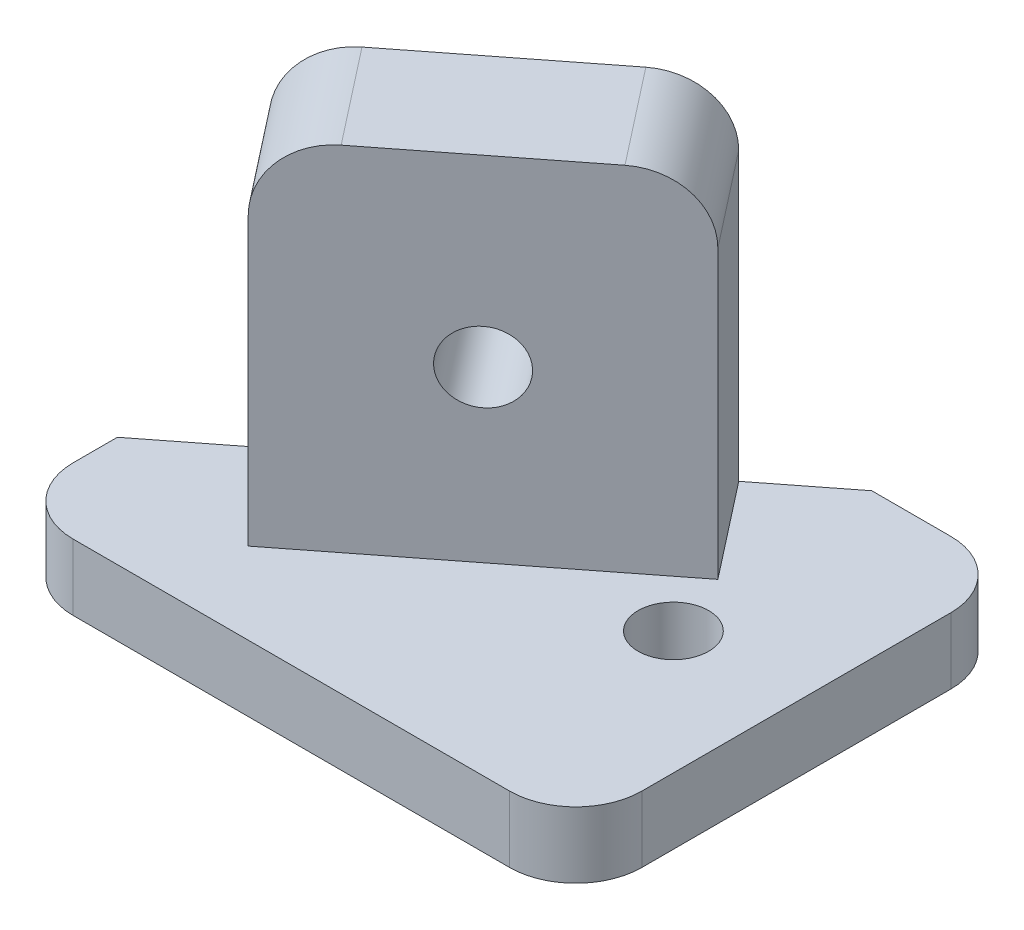
ISO-10303-21;
HEADER;
FILE_DESCRIPTION(('STEP AP214'),'2;1');
FILE_NAME('part.step','',(''),(''),'','','');
FILE_SCHEMA(('AUTOMOTIVE_DESIGN { 1 0 10303 214 1 1 1 1 }'));
ENDSEC;
DATA;
#1=APPLICATION_CONTEXT('core data for automotive mechanical design processes');
#2=APPLICATION_PROTOCOL_DEFINITION('international standard','automotive_design',2000,#1);
#3=PRODUCT_CONTEXT('',#1,'mechanical');
#4=PRODUCT('Part','Part','',(#3));
#5=PRODUCT_RELATED_PRODUCT_CATEGORY('part','',(#4));
#6=PRODUCT_DEFINITION_FORMATION('','',#4);
#7=PRODUCT_DEFINITION_CONTEXT('part definition',#1,'design');
#8=PRODUCT_DEFINITION('design','',#6,#7);
#9=PRODUCT_DEFINITION_SHAPE('','',#8);
#10=(LENGTH_UNIT() NAMED_UNIT(*) SI_UNIT(.MILLI.,.METRE.));
#11=(NAMED_UNIT(*) PLANE_ANGLE_UNIT() SI_UNIT($,.RADIAN.));
#12=(NAMED_UNIT(*) SI_UNIT($,.STERADIAN.) SOLID_ANGLE_UNIT());
#13=UNCERTAINTY_MEASURE_WITH_UNIT(LENGTH_MEASURE(1.E-05),#10,'distance_accuracy_value','');
#14=(GEOMETRIC_REPRESENTATION_CONTEXT(3) GLOBAL_UNCERTAINTY_ASSIGNED_CONTEXT((#13)) GLOBAL_UNIT_ASSIGNED_CONTEXT((#10,
#11,#12)) REPRESENTATION_CONTEXT('',''));
#15=CARTESIAN_POINT('',(0.,0.,0.));
#16=DIRECTION('',(0.,0.,1.));
#17=DIRECTION('',(1.,0.,0.));
#18=AXIS2_PLACEMENT_3D('',#15,#16,#17);
#19=CARTESIAN_POINT('',(0.,3.,0.));
#20=DIRECTION('',(0.,-1.,0.));
#21=DIRECTION('',(0.,0.,-1.));
#22=AXIS2_PLACEMENT_3D('',#19,#20,#21);
#23=PLANE('',#22);
#24=CARTESIAN_POINT('',(20.2068553419679,3.,-10.));
#25=DIRECTION('',(0.,1.,0.));
#26=DIRECTION('',(0.,0.,1.));
#27=AXIS2_PLACEMENT_3D('',#24,#25,#26);
#28=CIRCLE('',#27,1.6);
#29=CARTESIAN_POINT('',(20.2068553419679,3.,-8.4));
#30=VERTEX_POINT('',#29);
#31=EDGE_CURVE('E257',#30,#30,#28,.T.);
#32=ORIENTED_EDGE('',*,*,#31,.F.);
#33=EDGE_LOOP('',(#32));
#34=FACE_BOUND('',#33,.T.);
#35=DIRECTION('',(0.,0.,-1.));
#36=VECTOR('',#35,1.);
#37=CARTESIAN_POINT('',(25.7798023970531,3.,0.));
#38=LINE('',#37,#36);
#39=CARTESIAN_POINT('',(25.7798023970531,3.,-3.));
#40=VERTEX_POINT('',#39);
#41=CARTESIAN_POINT('',(25.7798023970531,3.,-17.));
#42=VERTEX_POINT('',#41);
#43=EDGE_CURVE('E274',#40,#42,#38,.T.);
#44=ORIENTED_EDGE('',*,*,#43,.T.);
#45=CARTESIAN_POINT('',(22.7798023970531,3.,-17.));
#46=DIRECTION('',(0.,-1.,0.));
#47=DIRECTION('',(0.,0.,-1.));
#48=AXIS2_PLACEMENT_3D('',#45,#46,#47);
#49=CIRCLE('',#48,3.);
#50=CARTESIAN_POINT('',(22.7798023970531,3.,-20.));
#51=VERTEX_POINT('',#50);
#52=EDGE_CURVE('E235',#42,#51,#49,.F.);
#53=ORIENTED_EDGE('',*,*,#52,.T.);
#54=DIRECTION('',(-1.,0.,0.));
#55=VECTOR('',#54,1.);
#56=CARTESIAN_POINT('',(19.1991244828961,3.,-20.));
#57=LINE('',#56,#55);
#58=CARTESIAN_POINT('',(19.1991244828961,3.,-20.));
#59=VERTEX_POINT('',#58);
#60=EDGE_CURVE('E271',#51,#59,#57,.T.);
#61=ORIENTED_EDGE('',*,*,#60,.T.);
#62=DIRECTION('',(-0.788010753606721,0.,0.61566147532566));
#63=VECTOR('',#62,1.);
#64=CARTESIAN_POINT('',(0.,3.,-5.));
#65=LINE('',#64,#63);
#66=CARTESIAN_POINT('',(15.8133388296092,3.,-17.3547343346542));
#67=VERTEX_POINT('',#66);
#68=EDGE_CURVE('E267',#59,#67,#65,.T.);
#69=ORIENTED_EDGE('',*,*,#68,.T.);
#70=DIRECTION('',(-0.61566147532566,0.,-0.78801075360672));
#71=VECTOR('',#70,1.);
#72=CARTESIAN_POINT('',(19.1913823456126,3.,-13.0310358031616));
#73=LINE('',#72,#71);
#74=CARTESIAN_POINT('',(19.1913823456126,3.,-13.0310358031616));
#75=VERTEX_POINT('',#74);
#76=EDGE_CURVE('E157',#75,#67,#73,.T.);
#77=ORIENTED_EDGE('',*,*,#76,.F.);
#78=DIRECTION('',(0.788010753606721,0.,-0.61566147532566));
#79=VECTOR('',#78,1.);
#80=CARTESIAN_POINT('',(7.23987337583888,3.,-3.69349363001129));
#81=LINE('',#80,#79);
#82=CARTESIAN_POINT('',(7.23987337583888,3.,-3.69349363001129));
#83=VERTEX_POINT('',#82);
#84=EDGE_CURVE('E142',#83,#75,#81,.T.);
#85=ORIENTED_EDGE('',*,*,#84,.F.);
#86=DIRECTION('',(0.61566147532566,0.,0.788010753606721));
#87=VECTOR('',#86,1.);
#88=CARTESIAN_POINT('',(3.86182985983547,3.,-8.01719216150392));
#89=LINE('',#88,#87);
#90=CARTESIAN_POINT('',(3.86182985983547,3.,-8.01719216150392));
#91=VERTEX_POINT('',#90);
#92=EDGE_CURVE('E153',#91,#83,#89,.T.);
#93=ORIENTED_EDGE('',*,*,#92,.F.);
#94=CARTESIAN_POINT('',(0.,3.,-5.));
#95=VERTEX_POINT('',#94);
#96=EDGE_CURVE('E168',#91,#95,#65,.T.);
#97=ORIENTED_EDGE('',*,*,#96,.T.);
#98=DIRECTION('',(0.,0.,1.));
#99=VECTOR('',#98,1.);
#100=CARTESIAN_POINT('',(0.,3.,0.));
#101=LINE('',#100,#99);
#102=CARTESIAN_POINT('',(0.,3.,-3.));
#103=VERTEX_POINT('',#102);
#104=EDGE_CURVE('E263',#95,#103,#101,.T.);
#105=ORIENTED_EDGE('',*,*,#104,.T.);
#106=CARTESIAN_POINT('',(3.,3.,-3.));
#107=DIRECTION('',(0.,-1.,0.));
#108=DIRECTION('',(0.,0.,-1.));
#109=AXIS2_PLACEMENT_3D('',#106,#107,#108);
#110=CIRCLE('',#109,3.);
#111=CARTESIAN_POINT('',(3.,3.,0.));
#112=VERTEX_POINT('',#111);
#113=EDGE_CURVE('E57',#103,#112,#110,.F.);
#114=ORIENTED_EDGE('',*,*,#113,.T.);
#115=DIRECTION('',(1.,0.,0.));
#116=VECTOR('',#115,1.);
#117=CARTESIAN_POINT('',(0.,3.,0.));
#118=LINE('',#117,#116);
#119=CARTESIAN_POINT('',(22.7798023970531,3.,0.));
#120=VERTEX_POINT('',#119);
#121=EDGE_CURVE('E242',#112,#120,#118,.T.);
#122=ORIENTED_EDGE('',*,*,#121,.T.);
#123=CARTESIAN_POINT('',(22.7798023970531,3.,-3.));
#124=DIRECTION('',(0.,-1.,0.));
#125=DIRECTION('',(0.,0.,-1.));
#126=AXIS2_PLACEMENT_3D('',#123,#124,#125);
#127=CIRCLE('',#126,3.);
#128=EDGE_CURVE('E232',#120,#40,#127,.F.);
#129=ORIENTED_EDGE('',*,*,#128,.T.);
#130=EDGE_LOOP('',(#44,#53,#61,#69,#77,#85,#93,#97,#105,#114,#122,#129));
#131=FACE_BOUND('',#130,.T.);
#132=ADVANCED_FACE('F35',(#34,#131),#23,.F.);
#133=CARTESIAN_POINT('',(0.,0.,0.));
#134=DIRECTION('',(0.,-1.,0.));
#135=DIRECTION('',(0.,0.,-1.));
#136=AXIS2_PLACEMENT_3D('',#133,#134,#135);
#137=PLANE('',#136);
#138=DIRECTION('',(-1.,0.,0.));
#139=VECTOR('',#138,1.);
#140=CARTESIAN_POINT('',(19.1991244828961,0.,-20.));
#141=LINE('',#140,#139);
#142=CARTESIAN_POINT('',(22.7798023970531,0.,-20.));
#143=VERTEX_POINT('',#142);
#144=CARTESIAN_POINT('',(19.1991244828961,0.,-20.));
#145=VERTEX_POINT('',#144);
#146=EDGE_CURVE('E255',#143,#145,#141,.T.);
#147=ORIENTED_EDGE('',*,*,#146,.F.);
#148=CARTESIAN_POINT('',(22.7798023970531,0.,-17.));
#149=DIRECTION('',(0.,-1.,0.));
#150=DIRECTION('',(0.,0.,-1.));
#151=AXIS2_PLACEMENT_3D('',#148,#149,#150);
#152=CIRCLE('',#151,3.);
#153=CARTESIAN_POINT('',(25.7798023970531,0.,-17.));
#154=VERTEX_POINT('',#153);
#155=EDGE_CURVE('E225',#143,#154,#152,.T.);
#156=ORIENTED_EDGE('',*,*,#155,.T.);
#157=DIRECTION('',(0.,0.,-1.));
#158=VECTOR('',#157,1.);
#159=CARTESIAN_POINT('',(25.7798023970531,0.,0.));
#160=LINE('',#159,#158);
#161=CARTESIAN_POINT('',(25.7798023970531,0.,-3.));
#162=VERTEX_POINT('',#161);
#163=EDGE_CURVE('E251',#162,#154,#160,.T.);
#164=ORIENTED_EDGE('',*,*,#163,.F.);
#165=CARTESIAN_POINT('',(22.7798023970531,0.,-3.));
#166=DIRECTION('',(0.,-1.,0.));
#167=DIRECTION('',(0.,0.,-1.));
#168=AXIS2_PLACEMENT_3D('',#165,#166,#167);
#169=CIRCLE('',#168,3.);
#170=CARTESIAN_POINT('',(22.7798023970531,0.,0.));
#171=VERTEX_POINT('',#170);
#172=EDGE_CURVE('E221',#162,#171,#169,.T.);
#173=ORIENTED_EDGE('',*,*,#172,.T.);
#174=DIRECTION('',(1.,0.,0.));
#175=VECTOR('',#174,1.);
#176=CARTESIAN_POINT('',(0.,0.,0.));
#177=LINE('',#176,#175);
#178=CARTESIAN_POINT('',(3.,0.,0.));
#179=VERTEX_POINT('',#178);
#180=EDGE_CURVE('E241',#179,#171,#177,.T.);
#181=ORIENTED_EDGE('',*,*,#180,.F.);
#182=CARTESIAN_POINT('',(3.,0.,-3.));
#183=DIRECTION('',(0.,-1.,0.));
#184=DIRECTION('',(0.,0.,-1.));
#185=AXIS2_PLACEMENT_3D('',#182,#183,#184);
#186=CIRCLE('',#185,3.);
#187=CARTESIAN_POINT('',(0.,0.,-3.));
#188=VERTEX_POINT('',#187);
#189=EDGE_CURVE('E223',#179,#188,#186,.T.);
#190=ORIENTED_EDGE('',*,*,#189,.T.);
#191=DIRECTION('',(0.,0.,1.));
#192=VECTOR('',#191,1.);
#193=CARTESIAN_POINT('',(0.,0.,0.));
#194=LINE('',#193,#192);
#195=CARTESIAN_POINT('',(0.,0.,-5.));
#196=VERTEX_POINT('',#195);
#197=EDGE_CURVE('E252',#196,#188,#194,.T.);
#198=ORIENTED_EDGE('',*,*,#197,.F.);
#199=DIRECTION('',(-0.788010753606721,0.,0.61566147532566));
#200=VECTOR('',#199,1.);
#201=CARTESIAN_POINT('',(0.,0.,-5.));
#202=LINE('',#201,#200);
#203=EDGE_CURVE('E261',#145,#196,#202,.T.);
#204=ORIENTED_EDGE('',*,*,#203,.F.);
#205=EDGE_LOOP('',(#147,#156,#164,#173,#181,#190,#198,#204));
#206=FACE_BOUND('',#205,.T.);
#207=CARTESIAN_POINT('',(20.2068553419679,0.,-10.));
#208=DIRECTION('',(0.,1.,0.));
#209=DIRECTION('',(0.,0.,1.));
#210=AXIS2_PLACEMENT_3D('',#207,#208,#209);
#211=CIRCLE('',#210,1.6);
#212=CARTESIAN_POINT('',(20.2068553419679,0.,-8.4));
#213=VERTEX_POINT('',#212);
#214=EDGE_CURVE('E180',#213,#213,#211,.T.);
#215=ORIENTED_EDGE('',*,*,#214,.T.);
#216=EDGE_LOOP('',(#215));
#217=FACE_BOUND('',#216,.T.);
#218=ADVANCED_FACE('F246',(#206,#217),#137,.T.);
#219=CARTESIAN_POINT('',(0.,3.,0.));
#220=DIRECTION('',(1.,0.,0.));
#221=DIRECTION('',(0.,0.,-1.));
#222=AXIS2_PLACEMENT_3D('',#219,#220,#221);
#223=PLANE('',#222);
#224=ORIENTED_EDGE('',*,*,#197,.T.);
#225=DIRECTION('',(0.,-1.,0.));
#226=VECTOR('',#225,1.);
#227=CARTESIAN_POINT('',(0.,3.,-3.));
#228=LINE('',#227,#226);
#229=EDGE_CURVE('E11',#188,#103,#228,.F.);
#230=ORIENTED_EDGE('',*,*,#229,.T.);
#231=ORIENTED_EDGE('',*,*,#104,.F.);
#232=DIRECTION('',(0.,-1.,0.));
#233=VECTOR('',#232,1.);
#234=CARTESIAN_POINT('',(0.,3.,-5.));
#235=LINE('',#234,#233);
#236=EDGE_CURVE('E264',#95,#196,#235,.T.);
#237=ORIENTED_EDGE('',*,*,#236,.T.);
#238=EDGE_LOOP('',(#224,#230,#231,#237));
#239=FACE_BOUND('',#238,.T.);
#240=ADVANCED_FACE('F315',(#239),#223,.F.);
#241=CARTESIAN_POINT('',(0.,3.,0.));
#242=DIRECTION('',(0.,0.,-1.));
#243=DIRECTION('',(-1.,0.,0.));
#244=AXIS2_PLACEMENT_3D('',#241,#242,#243);
#245=PLANE('',#244);
#246=ORIENTED_EDGE('',*,*,#121,.F.);
#247=DIRECTION('',(0.,-1.,0.));
#248=VECTOR('',#247,1.);
#249=CARTESIAN_POINT('',(3.,3.,0.));
#250=LINE('',#249,#248);
#251=EDGE_CURVE('E43',#112,#179,#250,.T.);
#252=ORIENTED_EDGE('',*,*,#251,.T.);
#253=ORIENTED_EDGE('',*,*,#180,.T.);
#254=DIRECTION('',(0.,-1.,0.));
#255=VECTOR('',#254,1.);
#256=CARTESIAN_POINT('',(22.7798023970531,3.,0.));
#257=LINE('',#256,#255);
#258=EDGE_CURVE('E50',#171,#120,#257,.F.);
#259=ORIENTED_EDGE('',*,*,#258,.T.);
#260=EDGE_LOOP('',(#246,#252,#253,#259));
#261=FACE_BOUND('',#260,.T.);
#262=ADVANCED_FACE('F240',(#261),#245,.F.);
#263=CARTESIAN_POINT('',(25.7798023970531,3.,0.));
#264=DIRECTION('',(-1.,0.,0.));
#265=DIRECTION('',(0.,0.,1.));
#266=AXIS2_PLACEMENT_3D('',#263,#264,#265);
#267=PLANE('',#266);
#268=ORIENTED_EDGE('',*,*,#163,.T.);
#269=DIRECTION('',(0.,-1.,0.));
#270=VECTOR('',#269,1.);
#271=CARTESIAN_POINT('',(25.7798023970531,3.,-17.));
#272=LINE('',#271,#270);
#273=EDGE_CURVE('E230',#154,#42,#272,.F.);
#274=ORIENTED_EDGE('',*,*,#273,.T.);
#275=ORIENTED_EDGE('',*,*,#43,.F.);
#276=DIRECTION('',(0.,-1.,0.));
#277=VECTOR('',#276,1.);
#278=CARTESIAN_POINT('',(25.7798023970531,3.,-3.));
#279=LINE('',#278,#277);
#280=EDGE_CURVE('E227',#40,#162,#279,.T.);
#281=ORIENTED_EDGE('',*,*,#280,.T.);
#282=EDGE_LOOP('',(#268,#274,#275,#281));
#283=FACE_BOUND('',#282,.T.);
#284=ADVANCED_FACE('F323',(#283),#267,.F.);
#285=CARTESIAN_POINT('',(19.1991244828961,3.,-20.));
#286=DIRECTION('',(0.,0.,1.));
#287=DIRECTION('',(1.,0.,0.));
#288=AXIS2_PLACEMENT_3D('',#285,#286,#287);
#289=PLANE('',#288);
#290=ORIENTED_EDGE('',*,*,#60,.F.);
#291=DIRECTION('',(0.,-1.,0.));
#292=VECTOR('',#291,1.);
#293=CARTESIAN_POINT('',(22.7798023970531,3.,-20.));
#294=LINE('',#293,#292);
#295=EDGE_CURVE('E216',#51,#143,#294,.T.);
#296=ORIENTED_EDGE('',*,*,#295,.T.);
#297=ORIENTED_EDGE('',*,*,#146,.T.);
#298=DIRECTION('',(0.,-1.,0.));
#299=VECTOR('',#298,1.);
#300=CARTESIAN_POINT('',(19.1991244828961,3.,-20.));
#301=LINE('',#300,#299);
#302=EDGE_CURVE('E195',#59,#145,#301,.T.);
#303=ORIENTED_EDGE('',*,*,#302,.F.);
#304=EDGE_LOOP('',(#290,#296,#297,#303));
#305=FACE_BOUND('',#304,.T.);
#306=ADVANCED_FACE('F294',(#305),#289,.F.);
#307=CARTESIAN_POINT('',(0.,3.,-5.));
#308=DIRECTION('',(0.61566147532566,0.,0.788010753606721));
#309=DIRECTION('',(0.788010753606721,0.,-0.61566147532566));
#310=AXIS2_PLACEMENT_3D('',#307,#308,#309);
#311=PLANE('',#310);
#312=CARTESIAN_POINT('',(9.83758434472232,10.6819012309852,-12.6859632480791));
#313=DIRECTION('',(-0.61566147532566,0.,-0.788010753606721));
#314=DIRECTION('',(-0.788010753606721,0.,0.61566147532566));
#315=AXIS2_PLACEMENT_3D('',#312,#313,#314);
#316=CIRCLE('',#315,1.6);
#317=CARTESIAN_POINT('',(8.57676713895156,10.6819012309852,-11.700904887558));
#318=VERTEX_POINT('',#317);
#319=EDGE_CURVE('E164',#318,#318,#316,.T.);
#320=ORIENTED_EDGE('',*,*,#319,.F.);
#321=EDGE_LOOP('',(#320));
#322=FACE_BOUND('',#321,.T.);
#323=DIRECTION('',(0.,-1.,0.));
#324=VECTOR('',#323,1.);
#325=CARTESIAN_POINT('',(3.86182985983547,19.,-8.01719216150392));
#326=LINE('',#325,#324);
#327=CARTESIAN_POINT('',(3.86182985983547,16.,-8.01719216150392));
#328=VERTEX_POINT('',#327);
#329=EDGE_CURVE('E147',#328,#91,#326,.T.);
#330=ORIENTED_EDGE('',*,*,#329,.F.);
#331=CARTESIAN_POINT('',(6.22586212065564,16.,-9.8641765874809));
#332=DIRECTION('',(0.61566147532566,0.,0.788010753606721));
#333=DIRECTION('',(0.788010753606721,0.,-0.61566147532566));
#334=AXIS2_PLACEMENT_3D('',#331,#332,#333);
#335=CIRCLE('',#334,3.);
#336=CARTESIAN_POINT('',(6.22586212065564,19.,-9.8641765874809));
#337=VERTEX_POINT('',#336);
#338=EDGE_CURVE('E214',#328,#337,#335,.F.);
#339=ORIENTED_EDGE('',*,*,#338,.T.);
#340=DIRECTION('',(-0.788010753606721,0.,0.61566147532566));
#341=VECTOR('',#340,1.);
#342=CARTESIAN_POINT('',(15.8133388296092,19.,-17.3547343346542));
#343=LINE('',#342,#341);
#344=CARTESIAN_POINT('',(13.449306568789,19.,-15.5077499086773));
#345=VERTEX_POINT('',#344);
#346=EDGE_CURVE('E208',#345,#337,#343,.T.);
#347=ORIENTED_EDGE('',*,*,#346,.F.);
#348=CARTESIAN_POINT('',(13.449306568789,16.,-15.5077499086773));
#349=DIRECTION('',(0.61566147532566,0.,0.788010753606721));
#350=DIRECTION('',(0.788010753606721,0.,-0.61566147532566));
#351=AXIS2_PLACEMENT_3D('',#348,#349,#350);
#352=CIRCLE('',#351,3.);
#353=CARTESIAN_POINT('',(15.8133388296092,16.,-17.3547343346542));
#354=VERTEX_POINT('',#353);
#355=EDGE_CURVE('E184',#345,#354,#352,.F.);
#356=ORIENTED_EDGE('',*,*,#355,.T.);
#357=DIRECTION('',(0.,-1.,0.));
#358=VECTOR('',#357,1.);
#359=CARTESIAN_POINT('',(15.8133388296092,19.,-17.3547343346542));
#360=LINE('',#359,#358);
#361=EDGE_CURVE('E185',#354,#67,#360,.T.);
#362=ORIENTED_EDGE('',*,*,#361,.T.);
#363=ORIENTED_EDGE('',*,*,#68,.F.);
#364=ORIENTED_EDGE('',*,*,#302,.T.);
#365=ORIENTED_EDGE('',*,*,#203,.T.);
#366=ORIENTED_EDGE('',*,*,#236,.F.);
#367=ORIENTED_EDGE('',*,*,#96,.F.);
#368=EDGE_LOOP('',(#330,#339,#347,#356,#362,#363,#364,#365,#366,#367));
#369=FACE_BOUND('',#368,.T.);
#370=ADVANCED_FACE('F291',(#322,#369),#311,.F.);
#371=CARTESIAN_POINT('',(20.2068553419679,3.,-10.));
#372=DIRECTION('',(0.,-1.,0.));
#373=DIRECTION('',(0.,0.,-1.));
#374=AXIS2_PLACEMENT_3D('',#371,#372,#373);
#375=CYLINDRICAL_SURFACE('',#374,1.6);
#376=ORIENTED_EDGE('',*,*,#31,.T.);
#377=EDGE_LOOP('',(#376));
#378=FACE_BOUND('',#377,.T.);
#379=ORIENTED_EDGE('',*,*,#214,.F.);
#380=EDGE_LOOP('',(#379));
#381=FACE_BOUND('',#380,.T.);
#382=ADVANCED_FACE('F293',(#378,#381),#375,.F.);
#383=CARTESIAN_POINT('',(3.86182985983547,19.,-8.01719216150392));
#384=DIRECTION('',(0.788010753606721,0.,-0.61566147532566));
#385=DIRECTION('',(-0.61566147532566,0.,-0.788010753606721));
#386=AXIS2_PLACEMENT_3D('',#383,#384,#385);
#387=PLANE('',#386);
#388=DIRECTION('',(0.,-1.,0.));
#389=VECTOR('',#388,1.);
#390=CARTESIAN_POINT('',(7.23987337583888,19.,-3.69349363001129));
#391=LINE('',#390,#389);
#392=CARTESIAN_POINT('',(7.23987337583888,16.,-3.69349363001129));
#393=VERTEX_POINT('',#392);
#394=EDGE_CURVE('E137',#393,#83,#391,.T.);
#395=ORIENTED_EDGE('',*,*,#394,.F.);
#396=DIRECTION('',(0.61566147532566,0.,0.788010753606721));
#397=VECTOR('',#396,1.);
#398=CARTESIAN_POINT('',(3.86182985983547,16.,-8.01719216150392));
#399=LINE('',#398,#397);
#400=EDGE_CURVE('E182',#393,#328,#399,.F.);
#401=ORIENTED_EDGE('',*,*,#400,.T.);
#402=ORIENTED_EDGE('',*,*,#329,.T.);
#403=ORIENTED_EDGE('',*,*,#92,.T.);
#404=EDGE_LOOP('',(#395,#401,#402,#403));
#405=FACE_BOUND('',#404,.T.);
#406=ADVANCED_FACE('F159',(#405),#387,.F.);
#407=CARTESIAN_POINT('',(7.23987337583888,19.,-3.69349363001129));
#408=DIRECTION('',(-0.61566147532566,0.,-0.788010753606721));
#409=DIRECTION('',(-0.788010753606721,0.,0.61566147532566));
#410=AXIS2_PLACEMENT_3D('',#407,#408,#409);
#411=PLANE('',#410);
#412=CARTESIAN_POINT('',(13.2156278607257,10.6819012309852,-8.36226471658645));
#413=DIRECTION('',(-0.61566147532566,0.,-0.788010753606721));
#414=DIRECTION('',(-0.788010753606721,0.,0.61566147532566));
#415=AXIS2_PLACEMENT_3D('',#412,#413,#414);
#416=CIRCLE('',#415,1.6);
#417=CARTESIAN_POINT('',(11.954810654955,10.6819012309852,-7.3772063560654));
#418=VERTEX_POINT('',#417);
#419=EDGE_CURVE('E161',#418,#418,#416,.T.);
#420=ORIENTED_EDGE('',*,*,#419,.T.);
#421=EDGE_LOOP('',(#420));
#422=FACE_BOUND('',#421,.T.);
#423=DIRECTION('',(0.788010753606721,0.,-0.61566147532566));
#424=VECTOR('',#423,1.);
#425=CARTESIAN_POINT('',(7.23987337583888,19.,-3.69349363001129));
#426=LINE('',#425,#424);
#427=CARTESIAN_POINT('',(9.60390563665904,19.,-5.54047805598827));
#428=VERTEX_POINT('',#427);
#429=CARTESIAN_POINT('',(16.8273500847924,19.,-11.1840513771846));
#430=VERTEX_POINT('',#429);
#431=EDGE_CURVE('E187',#428,#430,#426,.T.);
#432=ORIENTED_EDGE('',*,*,#431,.F.);
#433=CARTESIAN_POINT('',(9.60390563665904,16.,-5.54047805598827));
#434=DIRECTION('',(-0.61566147532566,0.,-0.788010753606721));
#435=DIRECTION('',(-0.788010753606721,0.,0.61566147532566));
#436=AXIS2_PLACEMENT_3D('',#433,#434,#435);
#437=CIRCLE('',#436,3.);
#438=EDGE_CURVE('E143',#428,#393,#437,.F.);
#439=ORIENTED_EDGE('',*,*,#438,.T.);
#440=ORIENTED_EDGE('',*,*,#394,.T.);
#441=ORIENTED_EDGE('',*,*,#84,.T.);
#442=DIRECTION('',(0.,-1.,0.));
#443=VECTOR('',#442,1.);
#444=CARTESIAN_POINT('',(19.1913823456126,19.,-13.0310358031616));
#445=LINE('',#444,#443);
#446=CARTESIAN_POINT('',(19.1913823456126,16.,-13.0310358031616));
#447=VERTEX_POINT('',#446);
#448=EDGE_CURVE('E148',#447,#75,#445,.T.);
#449=ORIENTED_EDGE('',*,*,#448,.F.);
#450=CARTESIAN_POINT('',(16.8273500847924,16.,-11.1840513771846));
#451=DIRECTION('',(-0.61566147532566,0.,-0.788010753606721));
#452=DIRECTION('',(-0.788010753606721,0.,0.61566147532566));
#453=AXIS2_PLACEMENT_3D('',#450,#451,#452);
#454=CIRCLE('',#453,3.);
#455=EDGE_CURVE('E197',#447,#430,#454,.F.);
#456=ORIENTED_EDGE('',*,*,#455,.T.);
#457=EDGE_LOOP('',(#432,#439,#440,#441,#449,#456));
#458=FACE_BOUND('',#457,.T.);
#459=ADVANCED_FACE('F140',(#422,#458),#411,.F.);
#460=CARTESIAN_POINT('',(19.1913823456126,19.,-13.0310358031616));
#461=DIRECTION('',(-0.78801075360672,0.,0.61566147532566));
#462=DIRECTION('',(0.61566147532566,0.,0.78801075360672));
#463=AXIS2_PLACEMENT_3D('',#460,#461,#462);
#464=PLANE('',#463);
#465=ORIENTED_EDGE('',*,*,#361,.F.);
#466=DIRECTION('',(-0.61566147532566,0.,-0.78801075360672));
#467=VECTOR('',#466,1.);
#468=CARTESIAN_POINT('',(19.1913823456126,16.,-13.0310358031616));
#469=LINE('',#468,#467);
#470=EDGE_CURVE('E211',#354,#447,#469,.F.);
#471=ORIENTED_EDGE('',*,*,#470,.T.);
#472=ORIENTED_EDGE('',*,*,#448,.T.);
#473=ORIENTED_EDGE('',*,*,#76,.T.);
#474=EDGE_LOOP('',(#465,#471,#472,#473));
#475=FACE_BOUND('',#474,.T.);
#476=ADVANCED_FACE('F355',(#475),#464,.F.);
#477=CARTESIAN_POINT('',(0.,19.,0.));
#478=DIRECTION('',(0.,1.,0.));
#479=DIRECTION('',(0.,0.,1.));
#480=AXIS2_PLACEMENT_3D('',#477,#478,#479);
#481=PLANE('',#480);
#482=ORIENTED_EDGE('',*,*,#346,.T.);
#483=DIRECTION('',(0.61566147532566,0.,0.788010753606721));
#484=VECTOR('',#483,1.);
#485=CARTESIAN_POINT('',(9.60390563665904,19.,-5.54047805598827));
#486=LINE('',#485,#484);
#487=EDGE_CURVE('E194',#337,#428,#486,.T.);
#488=ORIENTED_EDGE('',*,*,#487,.T.);
#489=ORIENTED_EDGE('',*,*,#431,.T.);
#490=DIRECTION('',(-0.61566147532566,0.,-0.78801075360672));
#491=VECTOR('',#490,1.);
#492=CARTESIAN_POINT('',(13.449306568789,19.,-15.5077499086773));
#493=LINE('',#492,#491);
#494=EDGE_CURVE('E191',#430,#345,#493,.T.);
#495=ORIENTED_EDGE('',*,*,#494,.T.);
#496=EDGE_LOOP('',(#482,#488,#489,#495));
#497=FACE_BOUND('',#496,.T.);
#498=ADVANCED_FACE('F205',(#497),#481,.T.);
#499=CARTESIAN_POINT('',(22.0348755268989,10.6819012309852,2.92585753597023));
#500=DIRECTION('',(-0.61566147532566,0.,-0.788010753606721));
#501=DIRECTION('',(-0.788010753606721,0.,0.61566147532566));
#502=AXIS2_PLACEMENT_3D('',#499,#500,#501);
#503=CYLINDRICAL_SURFACE('',#502,1.6);
#504=ORIENTED_EDGE('',*,*,#319,.T.);
#505=EDGE_LOOP('',(#504));
#506=FACE_BOUND('',#505,.T.);
#507=ORIENTED_EDGE('',*,*,#419,.F.);
#508=EDGE_LOOP('',(#507));
#509=FACE_BOUND('',#508,.T.);
#510=ADVANCED_FACE('F288',(#506,#509),#503,.F.);
#511=CARTESIAN_POINT('',(8.65160143634563,16.,-6.75937184848174));
#512=DIRECTION('',(-0.61566147532566,0.,-0.788010753606721));
#513=DIRECTION('',(-0.788010753606721,0.,0.61566147532566));
#514=AXIS2_PLACEMENT_3D('',#511,#512,#513);
#515=CYLINDRICAL_SURFACE('',#514,3.);
#516=ORIENTED_EDGE('',*,*,#338,.F.);
#517=ORIENTED_EDGE('',*,*,#400,.F.);
#518=ORIENTED_EDGE('',*,*,#438,.F.);
#519=ORIENTED_EDGE('',*,*,#487,.F.);
#520=EDGE_LOOP('',(#516,#517,#518,#519));
#521=FACE_BOUND('',#520,.T.);
#522=ADVANCED_FACE('F298',(#521),#515,.T.);
#523=CARTESIAN_POINT('',(15.875045884479,16.,-12.4029451696781));
#524=DIRECTION('',(0.61566147532566,0.,0.78801075360672));
#525=DIRECTION('',(0.78801075360672,0.,-0.61566147532566));
#526=AXIS2_PLACEMENT_3D('',#523,#524,#525);
#527=CYLINDRICAL_SURFACE('',#526,3.);
#528=ORIENTED_EDGE('',*,*,#455,.F.);
#529=ORIENTED_EDGE('',*,*,#470,.F.);
#530=ORIENTED_EDGE('',*,*,#355,.F.);
#531=ORIENTED_EDGE('',*,*,#494,.F.);
#532=EDGE_LOOP('',(#528,#529,#530,#531));
#533=FACE_BOUND('',#532,.T.);
#534=ADVANCED_FACE('F210',(#533),#527,.T.);
#535=CARTESIAN_POINT('',(22.7798023970531,3.,-17.));
#536=DIRECTION('',(0.,-1.,0.));
#537=DIRECTION('',(0.,0.,-1.));
#538=AXIS2_PLACEMENT_3D('',#535,#536,#537);
#539=CYLINDRICAL_SURFACE('',#538,3.);
#540=ORIENTED_EDGE('',*,*,#52,.F.);
#541=ORIENTED_EDGE('',*,*,#273,.F.);
#542=ORIENTED_EDGE('',*,*,#155,.F.);
#543=ORIENTED_EDGE('',*,*,#295,.F.);
#544=EDGE_LOOP('',(#540,#541,#542,#543));
#545=FACE_BOUND('',#544,.T.);
#546=ADVANCED_FACE('F305',(#545),#539,.T.);
#547=CARTESIAN_POINT('',(3.,3.,-3.));
#548=DIRECTION('',(0.,-1.,0.));
#549=DIRECTION('',(0.,0.,-1.));
#550=AXIS2_PLACEMENT_3D('',#547,#548,#549);
#551=CYLINDRICAL_SURFACE('',#550,3.);
#552=ORIENTED_EDGE('',*,*,#113,.F.);
#553=ORIENTED_EDGE('',*,*,#229,.F.);
#554=ORIENTED_EDGE('',*,*,#189,.F.);
#555=ORIENTED_EDGE('',*,*,#251,.F.);
#556=EDGE_LOOP('',(#552,#553,#554,#555));
#557=FACE_BOUND('',#556,.T.);
#558=ADVANCED_FACE('F336',(#557),#551,.T.);
#559=CARTESIAN_POINT('',(22.7798023970531,3.,-3.));
#560=DIRECTION('',(0.,-1.,0.));
#561=DIRECTION('',(0.,0.,-1.));
#562=AXIS2_PLACEMENT_3D('',#559,#560,#561);
#563=CYLINDRICAL_SURFACE('',#562,3.);
#564=ORIENTED_EDGE('',*,*,#128,.F.);
#565=ORIENTED_EDGE('',*,*,#258,.F.);
#566=ORIENTED_EDGE('',*,*,#172,.F.);
#567=ORIENTED_EDGE('',*,*,#280,.F.);
#568=EDGE_LOOP('',(#564,#565,#566,#567));
#569=FACE_BOUND('',#568,.T.);
#570=ADVANCED_FACE('F37',(#569),#563,.T.);
#571=CLOSED_SHELL('',(#132,#218,#240,#262,#284,#306,#370,#382,#406,#459,#476,#498,#510,#522,
#534,#546,#558,#570));
#572=MANIFOLD_SOLID_BREP('B2',#571);
#573=ADVANCED_BREP_SHAPE_REPRESENTATION('',(#18,#572),#14);
#574=SHAPE_DEFINITION_REPRESENTATION(#9,#573);
ENDSEC;
END-ISO-10303-21;
